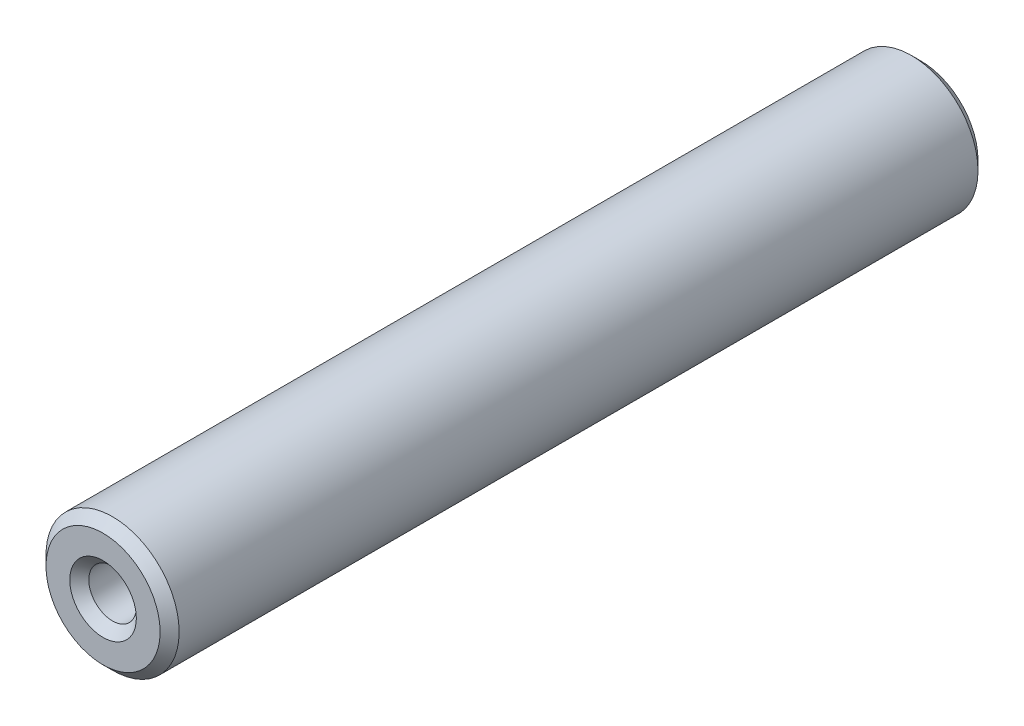
ISO-10303-21;
HEADER;
FILE_DESCRIPTION(('STEP AP214'),'2;1');
FILE_NAME('part.step','',(''),(''),'','','');
FILE_SCHEMA(('AUTOMOTIVE_DESIGN { 1 0 10303 214 1 1 1 1 }'));
ENDSEC;
DATA;
#1=APPLICATION_CONTEXT('core data for automotive mechanical design processes');
#2=APPLICATION_PROTOCOL_DEFINITION('international standard','automotive_design',2000,#1);
#3=PRODUCT_CONTEXT('',#1,'mechanical');
#4=PRODUCT('Part','Part','',(#3));
#5=PRODUCT_RELATED_PRODUCT_CATEGORY('part','',(#4));
#6=PRODUCT_DEFINITION_FORMATION('','',#4);
#7=PRODUCT_DEFINITION_CONTEXT('part definition',#1,'design');
#8=PRODUCT_DEFINITION('design','',#6,#7);
#9=PRODUCT_DEFINITION_SHAPE('','',#8);
#10=(LENGTH_UNIT() NAMED_UNIT(*) SI_UNIT(.MILLI.,.METRE.));
#11=(NAMED_UNIT(*) PLANE_ANGLE_UNIT() SI_UNIT($,.RADIAN.));
#12=(NAMED_UNIT(*) SI_UNIT($,.STERADIAN.) SOLID_ANGLE_UNIT());
#13=UNCERTAINTY_MEASURE_WITH_UNIT(LENGTH_MEASURE(1.E-05),#10,'distance_accuracy_value','');
#14=(GEOMETRIC_REPRESENTATION_CONTEXT(3) GLOBAL_UNCERTAINTY_ASSIGNED_CONTEXT((#13)) GLOBAL_UNIT_ASSIGNED_CONTEXT((#10,
#11,#12)) REPRESENTATION_CONTEXT('',''));
#15=CARTESIAN_POINT('',(0.,0.,0.));
#16=DIRECTION('',(0.,0.,1.));
#17=DIRECTION('',(1.,0.,0.));
#18=AXIS2_PLACEMENT_3D('',#15,#16,#17);
#19=CARTESIAN_POINT('',(0.,0.,21.5));
#20=DIRECTION('',(0.,0.,-1.));
#21=DIRECTION('',(-1.,0.,0.));
#22=AXIS2_PLACEMENT_3D('',#19,#20,#21);
#23=CYLINDRICAL_SURFACE('',#22,3.5);
#24=CARTESIAN_POINT('',(0.,0.,-21.));
#25=DIRECTION('',(0.,0.,1.));
#26=DIRECTION('',(1.,0.,0.));
#27=AXIS2_PLACEMENT_3D('',#24,#25,#26);
#28=CIRCLE('',#27,3.5);
#29=CARTESIAN_POINT('',(3.5,0.,-21.));
#30=VERTEX_POINT('',#29);
#31=EDGE_CURVE('E68',#30,#30,#28,.T.);
#32=ORIENTED_EDGE('',*,*,#31,.T.);
#33=EDGE_LOOP('',(#32));
#34=FACE_BOUND('',#33,.T.);
#35=CARTESIAN_POINT('',(0.,0.,21.));
#36=DIRECTION('',(0.,0.,1.));
#37=DIRECTION('',(1.,0.,0.));
#38=AXIS2_PLACEMENT_3D('',#35,#36,#37);
#39=CIRCLE('',#38,3.5);
#40=CARTESIAN_POINT('',(3.5,0.,21.));
#41=VERTEX_POINT('',#40);
#42=EDGE_CURVE('E63',#41,#41,#39,.F.);
#43=ORIENTED_EDGE('',*,*,#42,.T.);
#44=EDGE_LOOP('',(#43));
#45=FACE_BOUND('',#44,.T.);
#46=ADVANCED_FACE('F36',(#34,#45),#23,.T.);
#47=CARTESIAN_POINT('',(0.,0.,21.5));
#48=DIRECTION('',(0.,0.,1.));
#49=DIRECTION('',(1.,0.,0.));
#50=AXIS2_PLACEMENT_3D('',#47,#48,#49);
#51=PLANE('',#50);
#52=CARTESIAN_POINT('',(0.,0.,21.5));
#53=DIRECTION('',(0.,0.,1.));
#54=DIRECTION('',(1.,0.,0.));
#55=AXIS2_PLACEMENT_3D('',#52,#53,#54);
#56=CIRCLE('',#55,3.);
#57=CARTESIAN_POINT('',(3.,0.,21.5));
#58=VERTEX_POINT('',#57);
#59=EDGE_CURVE('E44',#58,#58,#56,.T.);
#60=ORIENTED_EDGE('',*,*,#59,.T.);
#61=EDGE_LOOP('',(#60));
#62=FACE_BOUND('',#61,.T.);
#63=CARTESIAN_POINT('',(0.,0.,21.5));
#64=DIRECTION('',(0.,0.,1.));
#65=DIRECTION('',(1.,0.,0.));
#66=AXIS2_PLACEMENT_3D('',#63,#64,#65);
#67=CIRCLE('',#66,1.75000000000001);
#68=CARTESIAN_POINT('',(1.75000000000001,0.,21.5));
#69=VERTEX_POINT('',#68);
#70=EDGE_CURVE('E80',#69,#69,#67,.F.);
#71=ORIENTED_EDGE('',*,*,#70,.T.);
#72=EDGE_LOOP('',(#71));
#73=FACE_BOUND('',#72,.T.);
#74=ADVANCED_FACE('F85',(#62,#73),#51,.T.);
#75=CARTESIAN_POINT('',(0.,0.,-21.5));
#76=DIRECTION('',(0.,0.,1.));
#77=DIRECTION('',(1.,0.,0.));
#78=AXIS2_PLACEMENT_3D('',#75,#76,#77);
#79=PLANE('',#78);
#80=CARTESIAN_POINT('',(0.,0.,-21.5));
#81=DIRECTION('',(0.,0.,1.));
#82=DIRECTION('',(1.,0.,0.));
#83=AXIS2_PLACEMENT_3D('',#80,#81,#82);
#84=CIRCLE('',#83,2.99999999999999);
#85=CARTESIAN_POINT('',(2.99999999999999,0.,-21.5));
#86=VERTEX_POINT('',#85);
#87=EDGE_CURVE('E74',#86,#86,#84,.F.);
#88=ORIENTED_EDGE('',*,*,#87,.T.);
#89=EDGE_LOOP('',(#88));
#90=FACE_BOUND('',#89,.T.);
#91=CARTESIAN_POINT('',(0.,0.,-21.5));
#92=DIRECTION('',(0.,0.,1.));
#93=DIRECTION('',(1.,0.,0.));
#94=AXIS2_PLACEMENT_3D('',#91,#92,#93);
#95=CIRCLE('',#94,1.75000000000001);
#96=CARTESIAN_POINT('',(1.75000000000001,0.,-21.5));
#97=VERTEX_POINT('',#96);
#98=EDGE_CURVE('E71',#97,#97,#95,.T.);
#99=ORIENTED_EDGE('',*,*,#98,.T.);
#100=EDGE_LOOP('',(#99));
#101=FACE_BOUND('',#100,.T.);
#102=ADVANCED_FACE('F107',(#90,#101),#79,.F.);
#103=CARTESIAN_POINT('',(0.,0.,-14.));
#104=DIRECTION('',(0.,0.,-1.));
#105=DIRECTION('',(-1.,0.,0.));
#106=AXIS2_PLACEMENT_3D('',#103,#104,#105);
#107=CONICAL_SURFACE('',#106,1.25,1.02974425867665);
#108=CARTESIAN_POINT('',(0.,0.,-13.2489242262155));
#109=VERTEX_POINT('',#108);
#110=VERTEX_LOOP('',#109);
#111=FACE_BOUND('',#110,.T.);
#112=CARTESIAN_POINT('',(0.,0.,-14.));
#113=DIRECTION('',(0.,0.,-1.));
#114=DIRECTION('',(-1.,0.,0.));
#115=AXIS2_PLACEMENT_3D('',#112,#113,#114);
#116=CIRCLE('',#115,1.25);
#117=CARTESIAN_POINT('',(-1.25,0.,-14.));
#118=VERTEX_POINT('',#117);
#119=EDGE_CURVE('E60',#118,#118,#116,.T.);
#120=ORIENTED_EDGE('',*,*,#119,.T.);
#121=EDGE_LOOP('',(#120));
#122=FACE_BOUND('',#121,.T.);
#123=ADVANCED_FACE('F125',(#111,#122),#107,.F.);
#124=CARTESIAN_POINT('',(0.,0.,-21.5));
#125=DIRECTION('',(0.,0.,-1.));
#126=DIRECTION('',(-1.,0.,0.));
#127=AXIS2_PLACEMENT_3D('',#124,#125,#126);
#128=CYLINDRICAL_SURFACE('',#127,1.25);
#129=CARTESIAN_POINT('',(0.,0.,-21.));
#130=DIRECTION('',(0.,0.,1.));
#131=DIRECTION('',(1.,0.,0.));
#132=AXIS2_PLACEMENT_3D('',#129,#130,#131);
#133=CIRCLE('',#132,1.25);
#134=CARTESIAN_POINT('',(1.25,0.,-21.));
#135=VERTEX_POINT('',#134);
#136=EDGE_CURVE('E77',#135,#135,#133,.F.);
#137=ORIENTED_EDGE('',*,*,#136,.T.);
#138=EDGE_LOOP('',(#137));
#139=FACE_BOUND('',#138,.T.);
#140=ORIENTED_EDGE('',*,*,#119,.F.);
#141=EDGE_LOOP('',(#140));
#142=FACE_BOUND('',#141,.T.);
#143=ADVANCED_FACE('F54',(#139,#142),#128,.F.);
#144=CARTESIAN_POINT('',(0.,0.,14.));
#145=DIRECTION('',(0.,0.,1.));
#146=DIRECTION('',(1.,0.,0.));
#147=AXIS2_PLACEMENT_3D('',#144,#145,#146);
#148=CONICAL_SURFACE('',#147,1.25,1.02974425867665);
#149=CARTESIAN_POINT('',(0.,0.,13.2489242262155));
#150=VERTEX_POINT('',#149);
#151=VERTEX_LOOP('',#150);
#152=FACE_BOUND('',#151,.T.);
#153=CARTESIAN_POINT('',(0.,0.,14.));
#154=DIRECTION('',(0.,0.,1.));
#155=DIRECTION('',(1.,0.,0.));
#156=AXIS2_PLACEMENT_3D('',#153,#154,#155);
#157=CIRCLE('',#156,1.25);
#158=CARTESIAN_POINT('',(1.25,0.,14.));
#159=VERTEX_POINT('',#158);
#160=EDGE_CURVE('E58',#159,#159,#157,.T.);
#161=ORIENTED_EDGE('',*,*,#160,.T.);
#162=EDGE_LOOP('',(#161));
#163=FACE_BOUND('',#162,.T.);
#164=ADVANCED_FACE('F50',(#152,#163),#148,.F.);
#165=CARTESIAN_POINT('',(0.,0.,21.5));
#166=DIRECTION('',(0.,0.,1.));
#167=DIRECTION('',(1.,0.,0.));
#168=AXIS2_PLACEMENT_3D('',#165,#166,#167);
#169=CYLINDRICAL_SURFACE('',#168,1.25);
#170=CARTESIAN_POINT('',(0.,0.,21.));
#171=DIRECTION('',(0.,0.,1.));
#172=DIRECTION('',(1.,0.,0.));
#173=AXIS2_PLACEMENT_3D('',#170,#171,#172);
#174=CIRCLE('',#173,1.25);
#175=CARTESIAN_POINT('',(1.25,0.,21.));
#176=VERTEX_POINT('',#175);
#177=EDGE_CURVE('E11',#176,#176,#174,.T.);
#178=ORIENTED_EDGE('',*,*,#177,.T.);
#179=EDGE_LOOP('',(#178));
#180=FACE_BOUND('',#179,.T.);
#181=ORIENTED_EDGE('',*,*,#160,.F.);
#182=EDGE_LOOP('',(#181));
#183=FACE_BOUND('',#182,.T.);
#184=ADVANCED_FACE('F53',(#180,#183),#169,.F.);
#185=CARTESIAN_POINT('',(0.,0.,-21.));
#186=DIRECTION('',(0.,0.,1.));
#187=DIRECTION('',(1.,0.,0.));
#188=AXIS2_PLACEMENT_3D('',#185,#186,#187);
#189=CONICAL_SURFACE('',#188,3.5,0.785398163397462);
#190=ORIENTED_EDGE('',*,*,#87,.F.);
#191=EDGE_LOOP('',(#190));
#192=FACE_BOUND('',#191,.T.);
#193=ORIENTED_EDGE('',*,*,#31,.F.);
#194=EDGE_LOOP('',(#193));
#195=FACE_BOUND('',#194,.T.);
#196=ADVANCED_FACE('F97',(#192,#195),#189,.T.);
#197=CARTESIAN_POINT('',(0.,0.,-21.));
#198=DIRECTION('',(0.,0.,-1.));
#199=DIRECTION('',(-1.,0.,0.));
#200=AXIS2_PLACEMENT_3D('',#197,#198,#199);
#201=CONICAL_SURFACE('',#200,1.25,0.785398163397461);
#202=ORIENTED_EDGE('',*,*,#98,.F.);
#203=EDGE_LOOP('',(#202));
#204=FACE_BOUND('',#203,.T.);
#205=ORIENTED_EDGE('',*,*,#136,.F.);
#206=EDGE_LOOP('',(#205));
#207=FACE_BOUND('',#206,.T.);
#208=ADVANCED_FACE('F90',(#204,#207),#201,.F.);
#209=CARTESIAN_POINT('',(0.,0.,21.5));
#210=DIRECTION('',(0.,0.,-1.));
#211=DIRECTION('',(-1.,0.,0.));
#212=AXIS2_PLACEMENT_3D('',#209,#210,#211);
#213=CONICAL_SURFACE('',#212,3.,0.785398163397448);
#214=ORIENTED_EDGE('',*,*,#42,.F.);
#215=EDGE_LOOP('',(#214));
#216=FACE_BOUND('',#215,.T.);
#217=ORIENTED_EDGE('',*,*,#59,.F.);
#218=EDGE_LOOP('',(#217));
#219=FACE_BOUND('',#218,.T.);
#220=ADVANCED_FACE('F88',(#216,#219),#213,.T.);
#221=CARTESIAN_POINT('',(0.,0.,21.));
#222=DIRECTION('',(0.,0.,1.));
#223=DIRECTION('',(1.,0.,0.));
#224=AXIS2_PLACEMENT_3D('',#221,#222,#223);
#225=CONICAL_SURFACE('',#224,1.25,0.785398163397461);
#226=ORIENTED_EDGE('',*,*,#70,.F.);
#227=EDGE_LOOP('',(#226));
#228=FACE_BOUND('',#227,.T.);
#229=ORIENTED_EDGE('',*,*,#177,.F.);
#230=EDGE_LOOP('',(#229));
#231=FACE_BOUND('',#230,.T.);
#232=ADVANCED_FACE('F38',(#228,#231),#225,.F.);
#233=CLOSED_SHELL('',(#46,#74,#102,#123,#143,#164,#184,#196,#208,#220,#232));
#234=MANIFOLD_SOLID_BREP('B2',#233);
#235=ADVANCED_BREP_SHAPE_REPRESENTATION('',(#18,#234),#14);
#236=SHAPE_DEFINITION_REPRESENTATION(#9,#235);
ENDSEC;
END-ISO-10303-21;
